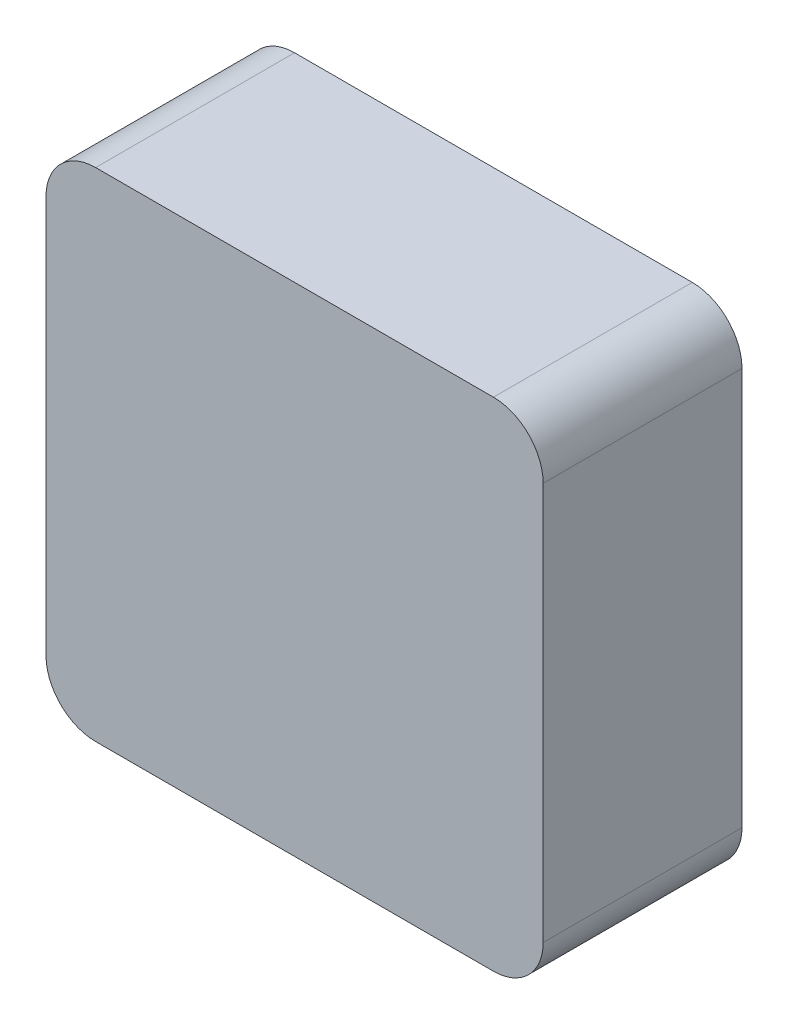
ISO-10303-21;
HEADER;
FILE_DESCRIPTION(('STEP AP214'),'2;1');
FILE_NAME('part.step','',(''),(''),'','','');
FILE_SCHEMA(('AUTOMOTIVE_DESIGN { 1 0 10303 214 1 1 1 1 }'));
ENDSEC;
DATA;
#1=APPLICATION_CONTEXT('core data for automotive mechanical design processes');
#2=APPLICATION_PROTOCOL_DEFINITION('international standard','automotive_design',2000,#1);
#3=PRODUCT_CONTEXT('',#1,'mechanical');
#4=PRODUCT('Part','Part','',(#3));
#5=PRODUCT_RELATED_PRODUCT_CATEGORY('part','',(#4));
#6=PRODUCT_DEFINITION_FORMATION('','',#4);
#7=PRODUCT_DEFINITION_CONTEXT('part definition',#1,'design');
#8=PRODUCT_DEFINITION('design','',#6,#7);
#9=PRODUCT_DEFINITION_SHAPE('','',#8);
#10=(LENGTH_UNIT() NAMED_UNIT(*) SI_UNIT(.MILLI.,.METRE.));
#11=(NAMED_UNIT(*) PLANE_ANGLE_UNIT() SI_UNIT($,.RADIAN.));
#12=(NAMED_UNIT(*) SI_UNIT($,.STERADIAN.) SOLID_ANGLE_UNIT());
#13=UNCERTAINTY_MEASURE_WITH_UNIT(LENGTH_MEASURE(1.E-05),#10,'distance_accuracy_value','');
#14=(GEOMETRIC_REPRESENTATION_CONTEXT(3) GLOBAL_UNCERTAINTY_ASSIGNED_CONTEXT((#13)) GLOBAL_UNIT_ASSIGNED_CONTEXT((#10,
#11,#12)) REPRESENTATION_CONTEXT('',''));
#15=CARTESIAN_POINT('',(0.,0.,0.));
#16=DIRECTION('',(0.,0.,1.));
#17=DIRECTION('',(1.,0.,0.));
#18=AXIS2_PLACEMENT_3D('',#15,#16,#17);
#19=CARTESIAN_POINT('',(-10.5729533783106,-43.2987614540329,8.));
#20=DIRECTION('',(0.,1.,0.));
#21=DIRECTION('',(0.,0.,1.));
#22=AXIS2_PLACEMENT_3D('',#19,#20,#21);
#23=PLANE('',#22);
#24=DIRECTION('',(1.,0.,0.));
#25=VECTOR('',#24,1.);
#26=CARTESIAN_POINT('',(-10.5729533783106,-43.2987614540329,0.));
#27=LINE('',#26,#25);
#28=CARTESIAN_POINT('',(-8.57295337831057,-43.2987614540329,0.));
#29=VERTEX_POINT('',#28);
#30=CARTESIAN_POINT('',(7.42704662168944,-43.2987614540329,0.));
#31=VERTEX_POINT('',#30);
#32=EDGE_CURVE('E126',#29,#31,#27,.T.);
#33=ORIENTED_EDGE('',*,*,#32,.T.);
#34=DIRECTION('',(0.,0.,-1.));
#35=VECTOR('',#34,1.);
#36=CARTESIAN_POINT('',(7.42704662168944,-43.2987614540329,8.));
#37=LINE('',#36,#35);
#38=CARTESIAN_POINT('',(7.42704662168944,-43.2987614540329,8.));
#39=VERTEX_POINT('',#38);
#40=EDGE_CURVE('E104',#31,#39,#37,.F.);
#41=ORIENTED_EDGE('',*,*,#40,.T.);
#42=DIRECTION('',(1.,0.,0.));
#43=VECTOR('',#42,1.);
#44=CARTESIAN_POINT('',(-10.5729533783106,-43.2987614540329,8.));
#45=LINE('',#44,#43);
#46=CARTESIAN_POINT('',(-8.57295337831057,-43.2987614540329,8.));
#47=VERTEX_POINT('',#46);
#48=EDGE_CURVE('E135',#47,#39,#45,.T.);
#49=ORIENTED_EDGE('',*,*,#48,.F.);
#50=DIRECTION('',(0.,0.,-1.));
#51=VECTOR('',#50,1.);
#52=CARTESIAN_POINT('',(-8.57295337831057,-43.2987614540329,8.));
#53=LINE('',#52,#51);
#54=EDGE_CURVE('E109',#47,#29,#53,.T.);
#55=ORIENTED_EDGE('',*,*,#54,.T.);
#56=EDGE_LOOP('',(#33,#41,#49,#55));
#57=FACE_BOUND('',#56,.T.);
#58=ADVANCED_FACE('F34',(#57),#23,.F.);
#59=CARTESIAN_POINT('',(9.42704662168944,-43.2987614540329,8.));
#60=DIRECTION('',(-1.,0.,0.));
#61=DIRECTION('',(0.,-1.,0.));
#62=AXIS2_PLACEMENT_3D('',#59,#60,#61);
#63=PLANE('',#62);
#64=DIRECTION('',(0.,1.,0.));
#65=VECTOR('',#64,1.);
#66=CARTESIAN_POINT('',(9.42704662168944,-43.2987614540329,8.));
#67=LINE('',#66,#65);
#68=CARTESIAN_POINT('',(9.42704662168944,-41.2987614540329,8.));
#69=VERTEX_POINT('',#68);
#70=CARTESIAN_POINT('',(9.42704662168944,-25.2987614540329,8.));
#71=VERTEX_POINT('',#70);
#72=EDGE_CURVE('E119',#69,#71,#67,.T.);
#73=ORIENTED_EDGE('',*,*,#72,.F.);
#74=DIRECTION('',(0.,0.,-1.));
#75=VECTOR('',#74,1.);
#76=CARTESIAN_POINT('',(9.42704662168944,-41.2987614540329,8.));
#77=LINE('',#76,#75);
#78=CARTESIAN_POINT('',(9.42704662168944,-41.2987614540329,0.));
#79=VERTEX_POINT('',#78);
#80=EDGE_CURVE('E103',#69,#79,#77,.T.);
#81=ORIENTED_EDGE('',*,*,#80,.T.);
#82=DIRECTION('',(0.,1.,0.));
#83=VECTOR('',#82,1.);
#84=CARTESIAN_POINT('',(9.42704662168944,-43.2987614540329,0.));
#85=LINE('',#84,#83);
#86=CARTESIAN_POINT('',(9.42704662168944,-25.2987614540329,0.));
#87=VERTEX_POINT('',#86);
#88=EDGE_CURVE('E116',#79,#87,#85,.T.);
#89=ORIENTED_EDGE('',*,*,#88,.T.);
#90=DIRECTION('',(0.,0.,-1.));
#91=VECTOR('',#90,1.);
#92=CARTESIAN_POINT('',(9.42704662168944,-25.2987614540329,8.));
#93=LINE('',#92,#91);
#94=EDGE_CURVE('E121',#87,#71,#93,.F.);
#95=ORIENTED_EDGE('',*,*,#94,.T.);
#96=EDGE_LOOP('',(#73,#81,#89,#95));
#97=FACE_BOUND('',#96,.T.);
#98=ADVANCED_FACE('F115',(#97),#63,.F.);
#99=CARTESIAN_POINT('',(9.42704662168944,-23.2987614540329,8.));
#100=DIRECTION('',(0.,-1.,0.));
#101=DIRECTION('',(1.,0.,0.));
#102=AXIS2_PLACEMENT_3D('',#99,#100,#101);
#103=PLANE('',#102);
#104=DIRECTION('',(-1.,0.,0.));
#105=VECTOR('',#104,1.);
#106=CARTESIAN_POINT('',(9.42704662168944,-23.2987614540329,8.));
#107=LINE('',#106,#105);
#108=CARTESIAN_POINT('',(7.42704662168944,-23.2987614540329,8.));
#109=VERTEX_POINT('',#108);
#110=CARTESIAN_POINT('',(-8.57295337831056,-23.2987614540329,8.));
#111=VERTEX_POINT('',#110);
#112=EDGE_CURVE('E169',#109,#111,#107,.T.);
#113=ORIENTED_EDGE('',*,*,#112,.F.);
#114=DIRECTION('',(0.,0.,-1.));
#115=VECTOR('',#114,1.);
#116=CARTESIAN_POINT('',(7.42704662168944,-23.2987614540329,8.));
#117=LINE('',#116,#115);
#118=CARTESIAN_POINT('',(7.42704662168944,-23.2987614540329,0.));
#119=VERTEX_POINT('',#118);
#120=EDGE_CURVE('E154',#109,#119,#117,.T.);
#121=ORIENTED_EDGE('',*,*,#120,.T.);
#122=DIRECTION('',(-1.,0.,0.));
#123=VECTOR('',#122,1.);
#124=CARTESIAN_POINT('',(9.42704662168944,-23.2987614540329,0.));
#125=LINE('',#124,#123);
#126=CARTESIAN_POINT('',(-8.57295337831056,-23.2987614540329,0.));
#127=VERTEX_POINT('',#126);
#128=EDGE_CURVE('E125',#119,#127,#125,.T.);
#129=ORIENTED_EDGE('',*,*,#128,.T.);
#130=DIRECTION('',(0.,0.,-1.));
#131=VECTOR('',#130,1.);
#132=CARTESIAN_POINT('',(-8.57295337831056,-23.2987614540329,8.));
#133=LINE('',#132,#131);
#134=EDGE_CURVE('E152',#127,#111,#133,.F.);
#135=ORIENTED_EDGE('',*,*,#134,.T.);
#136=EDGE_LOOP('',(#113,#121,#129,#135));
#137=FACE_BOUND('',#136,.T.);
#138=ADVANCED_FACE('F180',(#137),#103,.F.);
#139=CARTESIAN_POINT('',(-10.5729533783106,-23.2987614540329,8.));
#140=DIRECTION('',(1.,0.,0.));
#141=DIRECTION('',(0.,1.,0.));
#142=AXIS2_PLACEMENT_3D('',#139,#140,#141);
#143=PLANE('',#142);
#144=DIRECTION('',(0.,-1.,0.));
#145=VECTOR('',#144,1.);
#146=CARTESIAN_POINT('',(-10.5729533783106,-23.2987614540329,0.));
#147=LINE('',#146,#145);
#148=CARTESIAN_POINT('',(-10.5729533783106,-25.2987614540329,0.));
#149=VERTEX_POINT('',#148);
#150=CARTESIAN_POINT('',(-10.5729533783106,-41.2987614540329,0.));
#151=VERTEX_POINT('',#150);
#152=EDGE_CURVE('E129',#149,#151,#147,.T.);
#153=ORIENTED_EDGE('',*,*,#152,.T.);
#154=DIRECTION('',(0.,0.,-1.));
#155=VECTOR('',#154,1.);
#156=CARTESIAN_POINT('',(-10.5729533783106,-41.2987614540329,8.));
#157=LINE('',#156,#155);
#158=CARTESIAN_POINT('',(-10.5729533783106,-41.2987614540329,8.));
#159=VERTEX_POINT('',#158);
#160=EDGE_CURVE('E11',#151,#159,#157,.F.);
#161=ORIENTED_EDGE('',*,*,#160,.T.);
#162=DIRECTION('',(0.,-1.,0.));
#163=VECTOR('',#162,1.);
#164=CARTESIAN_POINT('',(-10.5729533783106,-23.2987614540329,8.));
#165=LINE('',#164,#163);
#166=CARTESIAN_POINT('',(-10.5729533783106,-25.2987614540329,8.));
#167=VERTEX_POINT('',#166);
#168=EDGE_CURVE('E136',#167,#159,#165,.T.);
#169=ORIENTED_EDGE('',*,*,#168,.F.);
#170=DIRECTION('',(0.,0.,-1.));
#171=VECTOR('',#170,1.);
#172=CARTESIAN_POINT('',(-10.5729533783106,-25.2987614540329,8.));
#173=LINE('',#172,#171);
#174=EDGE_CURVE('E42',#167,#149,#173,.T.);
#175=ORIENTED_EDGE('',*,*,#174,.T.);
#176=EDGE_LOOP('',(#153,#161,#169,#175));
#177=FACE_BOUND('',#176,.T.);
#178=ADVANCED_FACE('F159',(#177),#143,.F.);
#179=CARTESIAN_POINT('',(0.,0.,8.));
#180=DIRECTION('',(0.,0.,1.));
#181=DIRECTION('',(1.,0.,0.));
#182=AXIS2_PLACEMENT_3D('',#179,#180,#181);
#183=PLANE('',#182);
#184=ORIENTED_EDGE('',*,*,#48,.T.);
#185=CARTESIAN_POINT('',(7.42704662168944,-41.2987614540329,8.));
#186=DIRECTION('',(0.,0.,1.));
#187=DIRECTION('',(1.,0.,0.));
#188=AXIS2_PLACEMENT_3D('',#185,#186,#187);
#189=CIRCLE('',#188,2.);
#190=EDGE_CURVE('E150',#39,#69,#189,.T.);
#191=ORIENTED_EDGE('',*,*,#190,.T.);
#192=ORIENTED_EDGE('',*,*,#72,.T.);
#193=CARTESIAN_POINT('',(7.42704662168944,-25.2987614540329,8.));
#194=DIRECTION('',(0.,0.,1.));
#195=DIRECTION('',(1.,0.,0.));
#196=AXIS2_PLACEMENT_3D('',#193,#194,#195);
#197=CIRCLE('',#196,2.);
#198=EDGE_CURVE('E148',#71,#109,#197,.T.);
#199=ORIENTED_EDGE('',*,*,#198,.T.);
#200=ORIENTED_EDGE('',*,*,#112,.T.);
#201=CARTESIAN_POINT('',(-8.57295337831056,-25.2987614540329,8.));
#202=DIRECTION('',(0.,0.,1.));
#203=DIRECTION('',(1.,0.,0.));
#204=AXIS2_PLACEMENT_3D('',#201,#202,#203);
#205=CIRCLE('',#204,2.);
#206=EDGE_CURVE('E54',#111,#167,#205,.T.);
#207=ORIENTED_EDGE('',*,*,#206,.T.);
#208=ORIENTED_EDGE('',*,*,#168,.T.);
#209=CARTESIAN_POINT('',(-8.57295337831057,-41.2987614540329,8.));
#210=DIRECTION('',(0.,0.,1.));
#211=DIRECTION('',(1.,0.,0.));
#212=AXIS2_PLACEMENT_3D('',#209,#210,#211);
#213=CIRCLE('',#212,2.);
#214=EDGE_CURVE('E146',#159,#47,#213,.T.);
#215=ORIENTED_EDGE('',*,*,#214,.T.);
#216=EDGE_LOOP('',(#184,#191,#192,#199,#200,#207,#208,#215));
#217=FACE_BOUND('',#216,.T.);
#218=ADVANCED_FACE('F172',(#217),#183,.T.);
#219=CARTESIAN_POINT('',(0.,0.,0.));
#220=DIRECTION('',(0.,0.,1.));
#221=DIRECTION('',(1.,0.,0.));
#222=AXIS2_PLACEMENT_3D('',#219,#220,#221);
#223=PLANE('',#222);
#224=ORIENTED_EDGE('',*,*,#88,.F.);
#225=CARTESIAN_POINT('',(7.42704662168944,-41.2987614540329,0.));
#226=DIRECTION('',(0.,0.,1.));
#227=DIRECTION('',(1.,0.,0.));
#228=AXIS2_PLACEMENT_3D('',#225,#226,#227);
#229=CIRCLE('',#228,2.);
#230=EDGE_CURVE('E99',#79,#31,#229,.F.);
#231=ORIENTED_EDGE('',*,*,#230,.T.);
#232=ORIENTED_EDGE('',*,*,#32,.F.);
#233=CARTESIAN_POINT('',(-8.57295337831057,-41.2987614540329,0.));
#234=DIRECTION('',(0.,0.,1.));
#235=DIRECTION('',(1.,0.,0.));
#236=AXIS2_PLACEMENT_3D('',#233,#234,#235);
#237=CIRCLE('',#236,2.);
#238=EDGE_CURVE('E139',#29,#151,#237,.F.);
#239=ORIENTED_EDGE('',*,*,#238,.T.);
#240=ORIENTED_EDGE('',*,*,#152,.F.);
#241=CARTESIAN_POINT('',(-8.57295337831056,-25.2987614540329,0.));
#242=DIRECTION('',(0.,0.,1.));
#243=DIRECTION('',(1.,0.,0.));
#244=AXIS2_PLACEMENT_3D('',#241,#242,#243);
#245=CIRCLE('',#244,2.);
#246=EDGE_CURVE('E120',#149,#127,#245,.F.);
#247=ORIENTED_EDGE('',*,*,#246,.T.);
#248=ORIENTED_EDGE('',*,*,#128,.F.);
#249=CARTESIAN_POINT('',(7.42704662168944,-25.2987614540329,0.));
#250=DIRECTION('',(0.,0.,1.));
#251=DIRECTION('',(1.,0.,0.));
#252=AXIS2_PLACEMENT_3D('',#249,#250,#251);
#253=CIRCLE('',#252,2.);
#254=EDGE_CURVE('E110',#119,#87,#253,.F.);
#255=ORIENTED_EDGE('',*,*,#254,.T.);
#256=EDGE_LOOP('',(#224,#231,#232,#239,#240,#247,#248,#255));
#257=FACE_BOUND('',#256,.T.);
#258=ADVANCED_FACE('F123',(#257),#223,.F.);
#259=CARTESIAN_POINT('',(7.42704662168944,-41.2987614540329,8.));
#260=DIRECTION('',(0.,0.,-1.));
#261=DIRECTION('',(-1.,0.,0.));
#262=AXIS2_PLACEMENT_3D('',#259,#260,#261);
#263=CYLINDRICAL_SURFACE('',#262,2.);
#264=ORIENTED_EDGE('',*,*,#190,.F.);
#265=ORIENTED_EDGE('',*,*,#40,.F.);
#266=ORIENTED_EDGE('',*,*,#230,.F.);
#267=ORIENTED_EDGE('',*,*,#80,.F.);
#268=EDGE_LOOP('',(#264,#265,#266,#267));
#269=FACE_BOUND('',#268,.T.);
#270=ADVANCED_FACE('F102',(#269),#263,.T.);
#271=CARTESIAN_POINT('',(7.42704662168944,-25.2987614540329,8.));
#272=DIRECTION('',(0.,0.,-1.));
#273=DIRECTION('',(-1.,0.,0.));
#274=AXIS2_PLACEMENT_3D('',#271,#272,#273);
#275=CYLINDRICAL_SURFACE('',#274,2.);
#276=ORIENTED_EDGE('',*,*,#198,.F.);
#277=ORIENTED_EDGE('',*,*,#94,.F.);
#278=ORIENTED_EDGE('',*,*,#254,.F.);
#279=ORIENTED_EDGE('',*,*,#120,.F.);
#280=EDGE_LOOP('',(#276,#277,#278,#279));
#281=FACE_BOUND('',#280,.T.);
#282=ADVANCED_FACE('F192',(#281),#275,.T.);
#283=CARTESIAN_POINT('',(-8.57295337831057,-41.2987614540329,8.));
#284=DIRECTION('',(0.,0.,-1.));
#285=DIRECTION('',(-1.,0.,0.));
#286=AXIS2_PLACEMENT_3D('',#283,#284,#285);
#287=CYLINDRICAL_SURFACE('',#286,2.);
#288=ORIENTED_EDGE('',*,*,#214,.F.);
#289=ORIENTED_EDGE('',*,*,#160,.F.);
#290=ORIENTED_EDGE('',*,*,#238,.F.);
#291=ORIENTED_EDGE('',*,*,#54,.F.);
#292=EDGE_LOOP('',(#288,#289,#290,#291));
#293=FACE_BOUND('',#292,.T.);
#294=ADVANCED_FACE('F164',(#293),#287,.T.);
#295=CARTESIAN_POINT('',(-8.57295337831056,-25.2987614540329,8.));
#296=DIRECTION('',(0.,0.,-1.));
#297=DIRECTION('',(-1.,0.,0.));
#298=AXIS2_PLACEMENT_3D('',#295,#296,#297);
#299=CYLINDRICAL_SURFACE('',#298,2.);
#300=ORIENTED_EDGE('',*,*,#206,.F.);
#301=ORIENTED_EDGE('',*,*,#134,.F.);
#302=ORIENTED_EDGE('',*,*,#246,.F.);
#303=ORIENTED_EDGE('',*,*,#174,.F.);
#304=EDGE_LOOP('',(#300,#301,#302,#303));
#305=FACE_BOUND('',#304,.T.);
#306=ADVANCED_FACE('F36',(#305),#299,.T.);
#307=CLOSED_SHELL('',(#58,#98,#138,#178,#218,#258,#270,#282,#294,#306));
#308=MANIFOLD_SOLID_BREP('B2',#307);
#309=ADVANCED_BREP_SHAPE_REPRESENTATION('',(#18,#308),#14);
#310=SHAPE_DEFINITION_REPRESENTATION(#9,#309);
ENDSEC;
END-ISO-10303-21;
